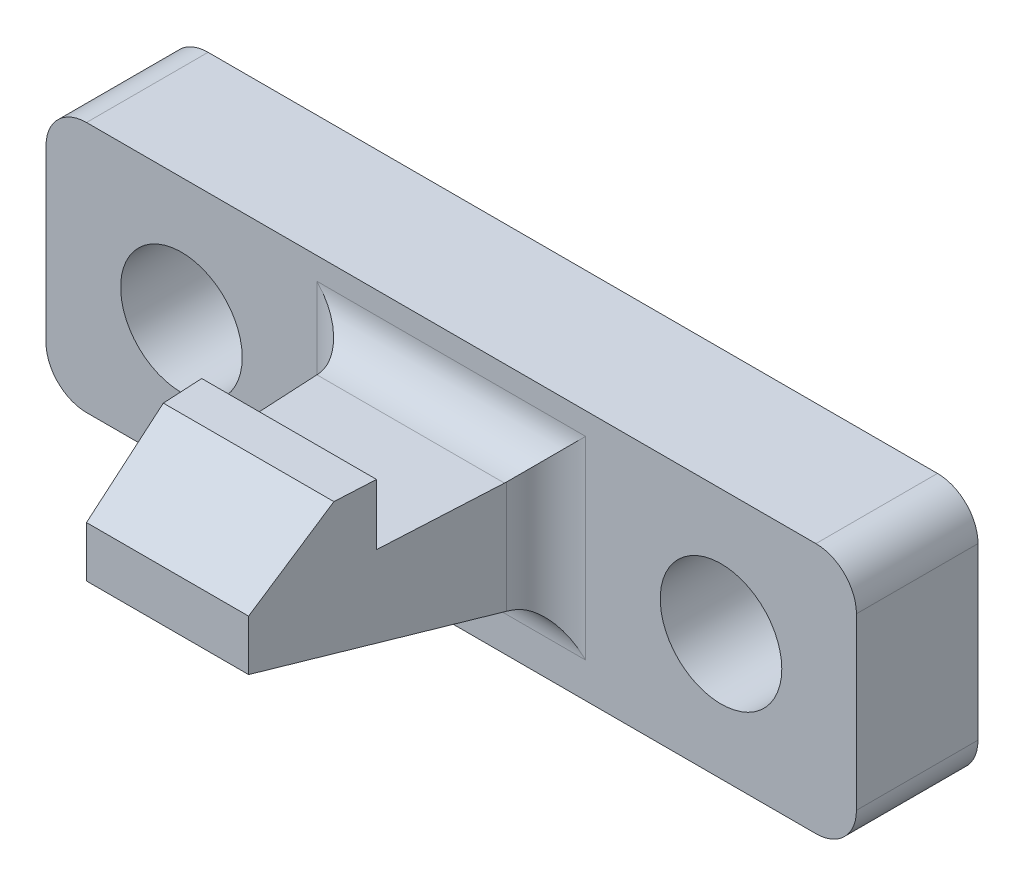
ISO-10303-21;
HEADER;
FILE_DESCRIPTION(('STEP AP214'),'2;1');
FILE_NAME('part.step','',(''),(''),'','','');
FILE_SCHEMA(('AUTOMOTIVE_DESIGN { 1 0 10303 214 1 1 1 1 }'));
ENDSEC;
DATA;
#1=APPLICATION_CONTEXT('core data for automotive mechanical design processes');
#2=APPLICATION_PROTOCOL_DEFINITION('international standard','automotive_design',2000,#1);
#3=PRODUCT_CONTEXT('',#1,'mechanical');
#4=PRODUCT('Part','Part','',(#3));
#5=PRODUCT_RELATED_PRODUCT_CATEGORY('part','',(#4));
#6=PRODUCT_DEFINITION_FORMATION('','',#4);
#7=PRODUCT_DEFINITION_CONTEXT('part definition',#1,'design');
#8=PRODUCT_DEFINITION('design','',#6,#7);
#9=PRODUCT_DEFINITION_SHAPE('','',#8);
#10=(LENGTH_UNIT() NAMED_UNIT(*) SI_UNIT(.MILLI.,.METRE.));
#11=(NAMED_UNIT(*) PLANE_ANGLE_UNIT() SI_UNIT($,.RADIAN.));
#12=(NAMED_UNIT(*) SI_UNIT($,.STERADIAN.) SOLID_ANGLE_UNIT());
#13=UNCERTAINTY_MEASURE_WITH_UNIT(LENGTH_MEASURE(1.E-05),#10,'distance_accuracy_value','');
#14=(GEOMETRIC_REPRESENTATION_CONTEXT(3) GLOBAL_UNCERTAINTY_ASSIGNED_CONTEXT((#13)) GLOBAL_UNIT_ASSIGNED_CONTEXT((#10,
#11,#12)) REPRESENTATION_CONTEXT('',''));
#15=CARTESIAN_POINT('',(0.,0.,0.));
#16=DIRECTION('',(0.,0.,1.));
#17=DIRECTION('',(1.,0.,0.));
#18=AXIS2_PLACEMENT_3D('',#15,#16,#17);
#19=CARTESIAN_POINT('',(10.,3.1,3.));
#20=DIRECTION('',(-1.,0.,0.));
#21=DIRECTION('',(0.,0.,1.));
#22=AXIS2_PLACEMENT_3D('',#19,#20,#21);
#23=PLANE('',#22);
#24=DIRECTION('',(0.,1.,0.));
#25=VECTOR('',#24,1.);
#26=CARTESIAN_POINT('',(10.,3.1,0.));
#27=LINE('',#26,#25);
#28=CARTESIAN_POINT('',(10.,-2.1,0.));
#29=VERTEX_POINT('',#28);
#30=CARTESIAN_POINT('',(10.,2.1,0.));
#31=VERTEX_POINT('',#30);
#32=EDGE_CURVE('E188',#29,#31,#27,.T.);
#33=ORIENTED_EDGE('',*,*,#32,.T.);
#34=DIRECTION('',(0.,0.,-1.));
#35=VECTOR('',#34,1.);
#36=CARTESIAN_POINT('',(10.,2.1,3.));
#37=LINE('',#36,#35);
#38=CARTESIAN_POINT('',(10.,2.1,3.));
#39=VERTEX_POINT('',#38);
#40=EDGE_CURVE('E294',#31,#39,#37,.F.);
#41=ORIENTED_EDGE('',*,*,#40,.T.);
#42=DIRECTION('',(0.,1.,0.));
#43=VECTOR('',#42,1.);
#44=CARTESIAN_POINT('',(10.,3.1,3.));
#45=LINE('',#44,#43);
#46=CARTESIAN_POINT('',(10.,-2.1,3.));
#47=VERTEX_POINT('',#46);
#48=EDGE_CURVE('E220',#47,#39,#45,.T.);
#49=ORIENTED_EDGE('',*,*,#48,.F.);
#50=DIRECTION('',(0.,0.,-1.));
#51=VECTOR('',#50,1.);
#52=CARTESIAN_POINT('',(10.,-2.1,3.));
#53=LINE('',#52,#51);
#54=EDGE_CURVE('E291',#47,#29,#53,.T.);
#55=ORIENTED_EDGE('',*,*,#54,.T.);
#56=EDGE_LOOP('',(#33,#41,#49,#55));
#57=FACE_BOUND('',#56,.T.);
#58=ADVANCED_FACE('F37',(#57),#23,.F.);
#59=CARTESIAN_POINT('',(-10.,3.1,3.));
#60=DIRECTION('',(0.,-1.,0.));
#61=DIRECTION('',(0.,0.,-1.));
#62=AXIS2_PLACEMENT_3D('',#59,#60,#61);
#63=PLANE('',#62);
#64=DIRECTION('',(-1.,0.,0.));
#65=VECTOR('',#64,1.);
#66=CARTESIAN_POINT('',(-10.,3.1,3.));
#67=LINE('',#66,#65);
#68=CARTESIAN_POINT('',(9.,3.1,3.));
#69=VERTEX_POINT('',#68);
#70=CARTESIAN_POINT('',(-9.,3.1,3.));
#71=VERTEX_POINT('',#70);
#72=EDGE_CURVE('E223',#69,#71,#67,.T.);
#73=ORIENTED_EDGE('',*,*,#72,.F.);
#74=DIRECTION('',(0.,0.,-1.));
#75=VECTOR('',#74,1.);
#76=CARTESIAN_POINT('',(9.,3.1,3.));
#77=LINE('',#76,#75);
#78=CARTESIAN_POINT('',(9.,3.1,0.));
#79=VERTEX_POINT('',#78);
#80=EDGE_CURVE('E280',#69,#79,#77,.T.);
#81=ORIENTED_EDGE('',*,*,#80,.T.);
#82=DIRECTION('',(-1.,0.,0.));
#83=VECTOR('',#82,1.);
#84=CARTESIAN_POINT('',(-10.,3.1,0.));
#85=LINE('',#84,#83);
#86=CARTESIAN_POINT('',(-9.,3.1,0.));
#87=VERTEX_POINT('',#86);
#88=EDGE_CURVE('E234',#79,#87,#85,.T.);
#89=ORIENTED_EDGE('',*,*,#88,.T.);
#90=DIRECTION('',(0.,0.,-1.));
#91=VECTOR('',#90,1.);
#92=CARTESIAN_POINT('',(-9.,3.1,3.));
#93=LINE('',#92,#91);
#94=EDGE_CURVE('E267',#87,#71,#93,.F.);
#95=ORIENTED_EDGE('',*,*,#94,.T.);
#96=EDGE_LOOP('',(#73,#81,#89,#95));
#97=FACE_BOUND('',#96,.T.);
#98=ADVANCED_FACE('F338',(#97),#63,.F.);
#99=CARTESIAN_POINT('',(-10.,3.1,3.));
#100=DIRECTION('',(1.,0.,0.));
#101=DIRECTION('',(0.,0.,-1.));
#102=AXIS2_PLACEMENT_3D('',#99,#100,#101);
#103=PLANE('',#102);
#104=DIRECTION('',(0.,-1.,0.));
#105=VECTOR('',#104,1.);
#106=CARTESIAN_POINT('',(-10.,3.1,0.));
#107=LINE('',#106,#105);
#108=CARTESIAN_POINT('',(-10.,2.1,0.));
#109=VERTEX_POINT('',#108);
#110=CARTESIAN_POINT('',(-10.,-2.1,0.));
#111=VERTEX_POINT('',#110);
#112=EDGE_CURVE('E237',#109,#111,#107,.T.);
#113=ORIENTED_EDGE('',*,*,#112,.T.);
#114=DIRECTION('',(0.,0.,-1.));
#115=VECTOR('',#114,1.);
#116=CARTESIAN_POINT('',(-10.,-2.1,3.));
#117=LINE('',#116,#115);
#118=CARTESIAN_POINT('',(-10.,-2.1,3.));
#119=VERTEX_POINT('',#118);
#120=EDGE_CURVE('E11',#111,#119,#117,.F.);
#121=ORIENTED_EDGE('',*,*,#120,.T.);
#122=DIRECTION('',(0.,-1.,0.));
#123=VECTOR('',#122,1.);
#124=CARTESIAN_POINT('',(-10.,3.1,3.));
#125=LINE('',#124,#123);
#126=CARTESIAN_POINT('',(-10.,2.1,3.));
#127=VERTEX_POINT('',#126);
#128=EDGE_CURVE('E227',#127,#119,#125,.T.);
#129=ORIENTED_EDGE('',*,*,#128,.F.);
#130=DIRECTION('',(0.,0.,-1.));
#131=VECTOR('',#130,1.);
#132=CARTESIAN_POINT('',(-10.,2.1,3.));
#133=LINE('',#132,#131);
#134=EDGE_CURVE('E45',#127,#109,#133,.T.);
#135=ORIENTED_EDGE('',*,*,#134,.T.);
#136=EDGE_LOOP('',(#113,#121,#129,#135));
#137=FACE_BOUND('',#136,.T.);
#138=ADVANCED_FACE('F311',(#137),#103,.F.);
#139=CARTESIAN_POINT('',(-10.,-3.1,3.));
#140=DIRECTION('',(0.,1.,0.));
#141=DIRECTION('',(0.,0.,1.));
#142=AXIS2_PLACEMENT_3D('',#139,#140,#141);
#143=PLANE('',#142);
#144=DIRECTION('',(1.,0.,0.));
#145=VECTOR('',#144,1.);
#146=CARTESIAN_POINT('',(-10.,-3.1,0.));
#147=LINE('',#146,#145);
#148=CARTESIAN_POINT('',(-9.,-3.1,0.));
#149=VERTEX_POINT('',#148);
#150=CARTESIAN_POINT('',(9.,-3.1,0.));
#151=VERTEX_POINT('',#150);
#152=EDGE_CURVE('E224',#149,#151,#147,.T.);
#153=ORIENTED_EDGE('',*,*,#152,.T.);
#154=DIRECTION('',(0.,0.,-1.));
#155=VECTOR('',#154,1.);
#156=CARTESIAN_POINT('',(9.,-3.1,3.));
#157=LINE('',#156,#155);
#158=CARTESIAN_POINT('',(9.,-3.1,3.));
#159=VERTEX_POINT('',#158);
#160=EDGE_CURVE('E52',#151,#159,#157,.F.);
#161=ORIENTED_EDGE('',*,*,#160,.T.);
#162=DIRECTION('',(1.,0.,0.));
#163=VECTOR('',#162,1.);
#164=CARTESIAN_POINT('',(-10.,-3.1,3.));
#165=LINE('',#164,#163);
#166=CARTESIAN_POINT('',(-9.,-3.1,3.));
#167=VERTEX_POINT('',#166);
#168=EDGE_CURVE('E229',#167,#159,#165,.T.);
#169=ORIENTED_EDGE('',*,*,#168,.F.);
#170=DIRECTION('',(0.,0.,-1.));
#171=VECTOR('',#170,1.);
#172=CARTESIAN_POINT('',(-9.,-3.1,3.));
#173=LINE('',#172,#171);
#174=EDGE_CURVE('E303',#167,#149,#173,.T.);
#175=ORIENTED_EDGE('',*,*,#174,.T.);
#176=EDGE_LOOP('',(#153,#161,#169,#175));
#177=FACE_BOUND('',#176,.T.);
#178=ADVANCED_FACE('F322',(#177),#143,.F.);
#179=CARTESIAN_POINT('',(0.,0.,3.));
#180=DIRECTION('',(0.,0.,1.));
#181=DIRECTION('',(1.,0.,0.));
#182=AXIS2_PLACEMENT_3D('',#179,#180,#181);
#183=PLANE('',#182);
#184=CARTESIAN_POINT('',(6.65790951084808,0.,3.));
#185=DIRECTION('',(0.,0.,-1.));
#186=DIRECTION('',(-1.,0.,0.));
#187=AXIS2_PLACEMENT_3D('',#184,#185,#186);
#188=CIRCLE('',#187,1.5);
#189=CARTESIAN_POINT('',(8.15790951084808,0.,3.));
#190=VERTEX_POINT('',#189);
#191=EDGE_CURVE('E563',#190,#190,#188,.T.);
#192=ORIENTED_EDGE('',*,*,#191,.T.);
#193=EDGE_LOOP('',(#192));
#194=FACE_BOUND('',#193,.T.);
#195=CARTESIAN_POINT('',(-6.65790951084808,0.,3.));
#196=DIRECTION('',(0.,0.,1.));
#197=DIRECTION('',(1.,0.,0.));
#198=AXIS2_PLACEMENT_3D('',#195,#196,#197);
#199=CIRCLE('',#198,1.5);
#200=CARTESIAN_POINT('',(-5.15790951084808,0.,3.));
#201=VERTEX_POINT('',#200);
#202=EDGE_CURVE('E567',#201,#201,#199,.T.);
#203=ORIENTED_EDGE('',*,*,#202,.F.);
#204=EDGE_LOOP('',(#203));
#205=FACE_BOUND('',#204,.T.);
#206=DIRECTION('',(0.,1.,0.));
#207=VECTOR('',#206,1.);
#208=CARTESIAN_POINT('',(-3.31581902169617,1.55,3.));
#209=LINE('',#208,#207);
#210=CARTESIAN_POINT('',(-3.31581902169617,-2.23077640640439,3.));
#211=VERTEX_POINT('',#210);
#212=CARTESIAN_POINT('',(-3.31581902169617,2.55,3.));
#213=VERTEX_POINT('',#212);
#214=EDGE_CURVE('E242',#211,#213,#209,.T.);
#215=ORIENTED_EDGE('',*,*,#214,.T.);
#216=DIRECTION('',(1.,0.,0.));
#217=VECTOR('',#216,1.);
#218=CARTESIAN_POINT('',(2.36685445498129,2.55,3.));
#219=LINE('',#218,#217);
#220=CARTESIAN_POINT('',(3.31581902169617,2.55,3.));
#221=VERTEX_POINT('',#220);
#222=EDGE_CURVE('E246',#213,#221,#219,.T.);
#223=ORIENTED_EDGE('',*,*,#222,.T.);
#224=DIRECTION('',(0.,-1.,0.));
#225=VECTOR('',#224,1.);
#226=CARTESIAN_POINT('',(3.31581902169617,-1.44999999999997,3.));
#227=LINE('',#226,#225);
#228=CARTESIAN_POINT('',(3.31581902169617,-2.23077640640439,3.));
#229=VERTEX_POINT('',#228);
#230=EDGE_CURVE('E244',#221,#229,#227,.T.);
#231=ORIENTED_EDGE('',*,*,#230,.T.);
#232=DIRECTION('',(-1.,0.,0.));
#233=VECTOR('',#232,1.);
#234=CARTESIAN_POINT('',(-2.36685445498129,-2.23077640640439,3.));
#235=LINE('',#234,#233);
#236=EDGE_CURVE('E231',#229,#211,#235,.T.);
#237=ORIENTED_EDGE('',*,*,#236,.T.);
#238=EDGE_LOOP('',(#215,#223,#231,#237));
#239=FACE_BOUND('',#238,.T.);
#240=ORIENTED_EDGE('',*,*,#48,.T.);
#241=CARTESIAN_POINT('',(9.,2.1,3.));
#242=DIRECTION('',(0.,0.,1.));
#243=DIRECTION('',(1.,0.,0.));
#244=AXIS2_PLACEMENT_3D('',#241,#242,#243);
#245=CIRCLE('',#244,1.);
#246=EDGE_CURVE('E301',#39,#69,#245,.T.);
#247=ORIENTED_EDGE('',*,*,#246,.T.);
#248=ORIENTED_EDGE('',*,*,#72,.T.);
#249=CARTESIAN_POINT('',(-9.,2.1,3.));
#250=DIRECTION('',(0.,0.,1.));
#251=DIRECTION('',(1.,0.,0.));
#252=AXIS2_PLACEMENT_3D('',#249,#250,#251);
#253=CIRCLE('',#252,1.);
#254=EDGE_CURVE('E296',#71,#127,#253,.T.);
#255=ORIENTED_EDGE('',*,*,#254,.T.);
#256=ORIENTED_EDGE('',*,*,#128,.T.);
#257=CARTESIAN_POINT('',(-9.,-2.1,3.));
#258=DIRECTION('',(0.,0.,1.));
#259=DIRECTION('',(1.,0.,0.));
#260=AXIS2_PLACEMENT_3D('',#257,#258,#259);
#261=CIRCLE('',#260,1.);
#262=EDGE_CURVE('E59',#119,#167,#261,.T.);
#263=ORIENTED_EDGE('',*,*,#262,.T.);
#264=ORIENTED_EDGE('',*,*,#168,.T.);
#265=CARTESIAN_POINT('',(9.,-2.1,3.));
#266=DIRECTION('',(0.,0.,1.));
#267=DIRECTION('',(1.,0.,0.));
#268=AXIS2_PLACEMENT_3D('',#265,#266,#267);
#269=CIRCLE('',#268,1.);
#270=EDGE_CURVE('E299',#159,#47,#269,.T.);
#271=ORIENTED_EDGE('',*,*,#270,.T.);
#272=EDGE_LOOP('',(#240,#247,#248,#255,#256,#263,#264,#271));
#273=FACE_BOUND('',#272,.T.);
#274=ADVANCED_FACE('F324',(#194,#205,#239,#273),#183,.T.);
#275=CARTESIAN_POINT('',(0.,0.,0.));
#276=DIRECTION('',(0.,0.,1.));
#277=DIRECTION('',(1.,0.,0.));
#278=AXIS2_PLACEMENT_3D('',#275,#276,#277);
#279=PLANE('',#278);
#280=CARTESIAN_POINT('',(6.65790951084808,0.,0.));
#281=DIRECTION('',(0.,0.,1.));
#282=DIRECTION('',(1.,0.,0.));
#283=AXIS2_PLACEMENT_3D('',#280,#281,#282);
#284=CIRCLE('',#283,1.5);
#285=CARTESIAN_POINT('',(8.15790951084808,0.,0.));
#286=VERTEX_POINT('',#285);
#287=EDGE_CURVE('E599',#286,#286,#284,.T.);
#288=ORIENTED_EDGE('',*,*,#287,.T.);
#289=EDGE_LOOP('',(#288));
#290=FACE_BOUND('',#289,.T.);
#291=CARTESIAN_POINT('',(-6.65790951084808,0.,0.));
#292=DIRECTION('',(0.,0.,1.));
#293=DIRECTION('',(1.,0.,0.));
#294=AXIS2_PLACEMENT_3D('',#291,#292,#293);
#295=CIRCLE('',#294,1.5);
#296=CARTESIAN_POINT('',(-5.15790951084808,0.,0.));
#297=VERTEX_POINT('',#296);
#298=EDGE_CURVE('E271',#297,#297,#295,.F.);
#299=ORIENTED_EDGE('',*,*,#298,.F.);
#300=EDGE_LOOP('',(#299));
#301=FACE_BOUND('',#300,.T.);
#302=ORIENTED_EDGE('',*,*,#88,.F.);
#303=CARTESIAN_POINT('',(9.,2.1,0.));
#304=DIRECTION('',(0.,0.,1.));
#305=DIRECTION('',(1.,0.,0.));
#306=AXIS2_PLACEMENT_3D('',#303,#304,#305);
#307=CIRCLE('',#306,1.);
#308=EDGE_CURVE('E289',#79,#31,#307,.F.);
#309=ORIENTED_EDGE('',*,*,#308,.T.);
#310=ORIENTED_EDGE('',*,*,#32,.F.);
#311=CARTESIAN_POINT('',(9.,-2.1,0.));
#312=DIRECTION('',(0.,0.,1.));
#313=DIRECTION('',(1.,0.,0.));
#314=AXIS2_PLACEMENT_3D('',#311,#312,#313);
#315=CIRCLE('',#314,1.);
#316=EDGE_CURVE('E287',#29,#151,#315,.F.);
#317=ORIENTED_EDGE('',*,*,#316,.T.);
#318=ORIENTED_EDGE('',*,*,#152,.F.);
#319=CARTESIAN_POINT('',(-9.,-2.1,0.));
#320=DIRECTION('',(0.,0.,1.));
#321=DIRECTION('',(1.,0.,0.));
#322=AXIS2_PLACEMENT_3D('',#319,#320,#321);
#323=CIRCLE('',#322,1.);
#324=EDGE_CURVE('E285',#149,#111,#323,.F.);
#325=ORIENTED_EDGE('',*,*,#324,.T.);
#326=ORIENTED_EDGE('',*,*,#112,.F.);
#327=CARTESIAN_POINT('',(-9.,2.1,0.));
#328=DIRECTION('',(0.,0.,1.));
#329=DIRECTION('',(1.,0.,0.));
#330=AXIS2_PLACEMENT_3D('',#327,#328,#329);
#331=CIRCLE('',#330,1.);
#332=EDGE_CURVE('E283',#109,#87,#331,.F.);
#333=ORIENTED_EDGE('',*,*,#332,.T.);
#334=EDGE_LOOP('',(#302,#309,#310,#317,#318,#325,#326,#333));
#335=FACE_BOUND('',#334,.T.);
#336=ADVANCED_FACE('F317',(#290,#301,#335),#279,.F.);
#337=CARTESIAN_POINT('',(0.,1.55,-493.5));
#338=DIRECTION('',(0.,1.,0.));
#339=DIRECTION('',(1.,0.,0.));
#340=AXIS2_PLACEMENT_3D('',#337,#338,#339);
#341=PLANE('',#340);
#342=DIRECTION('',(0.0523359562429438,0.,-0.998629534754574));
#343=VECTOR('',#342,1.);
#344=CARTESIAN_POINT('',(2.,1.55,9.99999999999995));
#345=LINE('',#344,#343);
#346=CARTESIAN_POINT('',(2.15722333784912,1.55,6.99999999999995));
#347=VERTEX_POINT('',#346);
#348=CARTESIAN_POINT('',(2.31444667569824,1.55,4.));
#349=VERTEX_POINT('',#348);
#350=EDGE_CURVE('E202',#347,#349,#345,.T.);
#351=ORIENTED_EDGE('',*,*,#350,.T.);
#352=DIRECTION('',(1.,0.,0.));
#353=VECTOR('',#352,1.);
#354=CARTESIAN_POINT('',(-2.36685445498129,1.55,4.));
#355=LINE('',#354,#353);
#356=CARTESIAN_POINT('',(-2.31444667569824,1.55,4.));
#357=VERTEX_POINT('',#356);
#358=EDGE_CURVE('E249',#349,#357,#355,.F.);
#359=ORIENTED_EDGE('',*,*,#358,.T.);
#360=DIRECTION('',(0.0523359562429438,0.,0.998629534754574));
#361=VECTOR('',#360,1.);
#362=CARTESIAN_POINT('',(-2.,1.55,9.99999999999995));
#363=LINE('',#362,#361);
#364=CARTESIAN_POINT('',(-2.15722333784912,1.55,6.99999999999995));
#365=VERTEX_POINT('',#364);
#366=EDGE_CURVE('E210',#357,#365,#363,.T.);
#367=ORIENTED_EDGE('',*,*,#366,.T.);
#368=DIRECTION('',(1.,0.,0.));
#369=VECTOR('',#368,1.);
#370=CARTESIAN_POINT('',(0.,1.55,6.99999999999995));
#371=LINE('',#370,#369);
#372=EDGE_CURVE('E185',#365,#347,#371,.T.);
#373=ORIENTED_EDGE('',*,*,#372,.T.);
#374=EDGE_LOOP('',(#351,#359,#367,#373));
#375=FACE_BOUND('',#374,.T.);
#376=ADVANCED_FACE('F492',(#375),#341,.T.);
#377=CARTESIAN_POINT('',(-2.,0.300000000000001,9.99999999999995));
#378=DIRECTION('',(-0.998629534754574,0.,0.0523359562429438));
#379=DIRECTION('',(-0.0523359562429438,0.,-0.998629534754574));
#380=AXIS2_PLACEMENT_3D('',#377,#378,#379);
#381=PLANE('',#380);
#382=CARTESIAN_POINT('',(-2.31444667569824,2.55,4.));
#383=DIRECTION('',(-0.998629534754574,0.,0.0523359562429438));
#384=DIRECTION('',(-0.0523359562429438,0.,-0.998629534754574));
#385=AXIS2_PLACEMENT_3D('',#382,#383,#384);
#386=ELLIPSE('',#385,1.00137234599792,1.);
#387=CARTESIAN_POINT('',(-2.31718948694159,1.55137046524543,3.94766404375706));
#388=VERTEX_POINT('',#387);
#389=EDGE_CURVE('E260',#357,#388,#386,.F.);
#390=ORIENTED_EDGE('',*,*,#389,.T.);
#391=DIRECTION('',(0.,1.,0.));
#392=VECTOR('',#391,1.);
#393=CARTESIAN_POINT('',(-2.31718948694159,-1.44999999999997,3.94766404375706));
#394=LINE('',#393,#392);
#395=CARTESIAN_POINT('',(-2.31718948694159,-1.21308398906071,3.94766404375706));
#396=VERTEX_POINT('',#395);
#397=EDGE_CURVE('E254',#388,#396,#394,.F.);
#398=ORIENTED_EDGE('',*,*,#397,.T.);
#399=DIRECTION('',(-0.0507774262496633,-0.242222752730215,-0.968891010920866));
#400=VECTOR('',#399,1.);
#401=CARTESIAN_POINT('',(-2.,0.300000000000001,9.99999999999995));
#402=LINE('',#401,#400);
#403=CARTESIAN_POINT('',(-2.,0.300000000000001,9.99999999999995));
#404=VERTEX_POINT('',#403);
#405=EDGE_CURVE('E217',#404,#396,#402,.T.);
#406=ORIENTED_EDGE('',*,*,#405,.F.);
#407=DIRECTION('',(0.,1.,0.));
#408=VECTOR('',#407,1.);
#409=CARTESIAN_POINT('',(-2.,0.300000000000001,9.99999999999995));
#410=LINE('',#409,#408);
#411=CARTESIAN_POINT('',(-2.,1.55,10.));
#412=VERTEX_POINT('',#411);
#413=EDGE_CURVE('E197',#404,#412,#410,.T.);
#414=ORIENTED_EDGE('',*,*,#413,.T.);
#415=DIRECTION('',(0.0418894228057637,-0.599473351745113,0.799297802326818));
#416=VECTOR('',#415,1.);
#417=CARTESIAN_POINT('',(-1.96861050913495,1.10078962568437,10.5989471657542));
#418=LINE('',#417,#416);
#419=CARTESIAN_POINT('',(-2.10481555856608,3.05,8.));
#420=VERTEX_POINT('',#419);
#421=EDGE_CURVE('E195',#420,#412,#418,.T.);
#422=ORIENTED_EDGE('',*,*,#421,.F.);
#423=DIRECTION('',(-0.0523359562429438,0.,-0.998629534754574));
#424=VECTOR('',#423,1.);
#425=CARTESIAN_POINT('',(-2.,3.05,9.99999999999995));
#426=LINE('',#425,#424);
#427=CARTESIAN_POINT('',(-2.15722333784912,3.05,6.99999999999995));
#428=VERTEX_POINT('',#427);
#429=EDGE_CURVE('E173',#420,#428,#426,.T.);
#430=ORIENTED_EDGE('',*,*,#429,.T.);
#431=DIRECTION('',(0.,1.,0.));
#432=VECTOR('',#431,1.);
#433=CARTESIAN_POINT('',(-2.15722333784912,0.300000000000001,6.99999999999995));
#434=LINE('',#433,#432);
#435=EDGE_CURVE('E178',#365,#428,#434,.T.);
#436=ORIENTED_EDGE('',*,*,#435,.F.);
#437=ORIENTED_EDGE('',*,*,#366,.F.);
#438=EDGE_LOOP('',(#390,#398,#406,#414,#422,#430,#436,#437));
#439=FACE_BOUND('',#438,.T.);
#440=ADVANCED_FACE('F192',(#439),#381,.T.);
#441=CARTESIAN_POINT('',(0.,0.300000000000001,9.99999999999995));
#442=DIRECTION('',(0.,0.,1.));
#443=DIRECTION('',(0.,1.,0.));
#444=AXIS2_PLACEMENT_3D('',#441,#442,#443);
#445=PLANE('',#444);
#446=ORIENTED_EDGE('',*,*,#413,.F.);
#447=DIRECTION('',(-1.,0.,0.));
#448=VECTOR('',#447,1.);
#449=CARTESIAN_POINT('',(0.,0.300000000000001,9.99999999999995));
#450=LINE('',#449,#448);
#451=CARTESIAN_POINT('',(2.,0.300000000000001,9.99999999999995));
#452=VERTEX_POINT('',#451);
#453=EDGE_CURVE('E216',#452,#404,#450,.T.);
#454=ORIENTED_EDGE('',*,*,#453,.F.);
#455=DIRECTION('',(0.,1.,0.));
#456=VECTOR('',#455,1.);
#457=CARTESIAN_POINT('',(2.,0.300000000000001,9.99999999999995));
#458=LINE('',#457,#456);
#459=CARTESIAN_POINT('',(2.,1.55,9.99999999999995));
#460=VERTEX_POINT('',#459);
#461=EDGE_CURVE('E196',#452,#460,#458,.T.);
#462=ORIENTED_EDGE('',*,*,#461,.T.);
#463=DIRECTION('',(1.,0.,0.));
#464=VECTOR('',#463,1.);
#465=CARTESIAN_POINT('',(0.,1.55,9.99999999999995));
#466=LINE('',#465,#464);
#467=EDGE_CURVE('E591',#412,#460,#466,.T.);
#468=ORIENTED_EDGE('',*,*,#467,.F.);
#469=EDGE_LOOP('',(#446,#454,#462,#468));
#470=FACE_BOUND('',#469,.T.);
#471=ADVANCED_FACE('F476',(#470),#445,.T.);
#472=CARTESIAN_POINT('',(0.,0.300000000000001,9.99999999999995));
#473=DIRECTION('',(0.,-0.970142500145332,0.242535625036331));
#474=DIRECTION('',(0.,0.242535625036331,0.970142500145332));
#475=AXIS2_PLACEMENT_3D('',#472,#473,#474);
#476=PLANE('',#475);
#477=CARTESIAN_POINT('',(-3.31581902169617,-1.19999999999998,4.));
#478=DIRECTION('',(0.,-0.970142500145332,0.242535625036331));
#479=DIRECTION('',(0.,-0.242535625036331,-0.970142500145332));
#480=AXIS2_PLACEMENT_3D('',#477,#478,#479);
#481=ELLIPSE('',#480,1.03077640640441,1.);
#482=CARTESIAN_POINT('',(-2.34567652155083,-1.26063390625906,3.75746437496367));
#483=VERTEX_POINT('',#482);
#484=EDGE_CURVE('E264',#396,#483,#481,.F.);
#485=ORIENTED_EDGE('',*,*,#484,.T.);
#486=DIRECTION('',(-1.,0.,0.));
#487=VECTOR('',#486,1.);
#488=CARTESIAN_POINT('',(2.36685445498129,-1.26063390625906,3.75746437496367));
#489=LINE('',#488,#487);
#490=CARTESIAN_POINT('',(2.34567652155083,-1.26063390625906,3.75746437496367));
#491=VERTEX_POINT('',#490);
#492=EDGE_CURVE('E256',#483,#491,#489,.F.);
#493=ORIENTED_EDGE('',*,*,#492,.T.);
#494=CARTESIAN_POINT('',(3.31581902169617,-1.19999999999998,4.));
#495=DIRECTION('',(0.,-0.970142500145332,0.242535625036331));
#496=DIRECTION('',(0.,0.242535625036331,0.970142500145332));
#497=AXIS2_PLACEMENT_3D('',#494,#495,#496);
#498=ELLIPSE('',#497,1.03077640640441,1.);
#499=CARTESIAN_POINT('',(2.31718948694159,-1.21308398906071,3.94766404375706));
#500=VERTEX_POINT('',#499);
#501=EDGE_CURVE('E262',#491,#500,#498,.F.);
#502=ORIENTED_EDGE('',*,*,#501,.T.);
#503=DIRECTION('',(-0.0507774262496633,0.242222752730215,0.968891010920866));
#504=VECTOR('',#503,1.);
#505=CARTESIAN_POINT('',(2.,0.300000000000001,9.99999999999995));
#506=LINE('',#505,#504);
#507=EDGE_CURVE('E200',#500,#452,#506,.T.);
#508=ORIENTED_EDGE('',*,*,#507,.T.);
#509=ORIENTED_EDGE('',*,*,#453,.T.);
#510=ORIENTED_EDGE('',*,*,#405,.T.);
#511=EDGE_LOOP('',(#485,#493,#502,#508,#509,#510));
#512=FACE_BOUND('',#511,.T.);
#513=ADVANCED_FACE('F464',(#512),#476,.T.);
#514=CARTESIAN_POINT('',(2.,0.300000000000001,9.99999999999995));
#515=DIRECTION('',(0.998629534754574,0.,0.0523359562429438));
#516=DIRECTION('',(-0.0523359562429438,0.,0.998629534754574));
#517=AXIS2_PLACEMENT_3D('',#514,#515,#516);
#518=PLANE('',#517);
#519=ORIENTED_EDGE('',*,*,#507,.F.);
#520=DIRECTION('',(0.,-1.,0.));
#521=VECTOR('',#520,1.);
#522=CARTESIAN_POINT('',(2.31718948694159,1.55,3.94766404375706));
#523=LINE('',#522,#521);
#524=CARTESIAN_POINT('',(2.31718948694159,1.55137046524543,3.94766404375706));
#525=VERTEX_POINT('',#524);
#526=EDGE_CURVE('E252',#500,#525,#523,.F.);
#527=ORIENTED_EDGE('',*,*,#526,.T.);
#528=CARTESIAN_POINT('',(2.31444667569824,2.55,4.));
#529=DIRECTION('',(0.998629534754574,0.,0.0523359562429438));
#530=DIRECTION('',(-0.0523359562429438,0.,0.998629534754574));
#531=AXIS2_PLACEMENT_3D('',#528,#529,#530);
#532=ELLIPSE('',#531,1.00137234599792,1.);
#533=EDGE_CURVE('E258',#525,#349,#532,.F.);
#534=ORIENTED_EDGE('',*,*,#533,.T.);
#535=ORIENTED_EDGE('',*,*,#350,.F.);
#536=DIRECTION('',(0.,1.,0.));
#537=VECTOR('',#536,1.);
#538=CARTESIAN_POINT('',(2.15722333784912,1.55,6.99999999999995));
#539=LINE('',#538,#537);
#540=CARTESIAN_POINT('',(2.15722333784912,3.05,6.99999999999995));
#541=VERTEX_POINT('',#540);
#542=EDGE_CURVE('E209',#347,#541,#539,.T.);
#543=ORIENTED_EDGE('',*,*,#542,.T.);
#544=DIRECTION('',(-0.0523359562429438,0.,0.998629534754574));
#545=VECTOR('',#544,1.);
#546=CARTESIAN_POINT('',(2.,3.05,9.99999999999995));
#547=LINE('',#546,#545);
#548=CARTESIAN_POINT('',(2.10481555856608,3.05,8.));
#549=VERTEX_POINT('',#548);
#550=EDGE_CURVE('E175',#541,#549,#547,.T.);
#551=ORIENTED_EDGE('',*,*,#550,.T.);
#552=DIRECTION('',(0.0418894228057637,0.599473351745113,-0.799297802326818));
#553=VECTOR('',#552,1.);
#554=CARTESIAN_POINT('',(1.96861050913495,1.10078962568437,10.5989471657542));
#555=LINE('',#554,#553);
#556=EDGE_CURVE('E179',#460,#549,#555,.T.);
#557=ORIENTED_EDGE('',*,*,#556,.F.);
#558=ORIENTED_EDGE('',*,*,#461,.F.);
#559=EDGE_LOOP('',(#519,#527,#534,#535,#543,#551,#557,#558));
#560=FACE_BOUND('',#559,.T.);
#561=ADVANCED_FACE('F455',(#560),#518,.T.);
#562=CARTESIAN_POINT('',(0.,1.55,10.));
#563=DIRECTION('',(0.,0.8,0.6));
#564=DIRECTION('',(0.,0.6,-0.8));
#565=AXIS2_PLACEMENT_3D('',#562,#563,#564);
#566=PLANE('',#565);
#567=DIRECTION('',(-1.,0.,0.));
#568=VECTOR('',#567,1.);
#569=CARTESIAN_POINT('',(0.,3.05,8.));
#570=LINE('',#569,#568);
#571=EDGE_CURVE('E206',#549,#420,#570,.T.);
#572=ORIENTED_EDGE('',*,*,#571,.T.);
#573=ORIENTED_EDGE('',*,*,#421,.T.);
#574=ORIENTED_EDGE('',*,*,#467,.T.);
#575=ORIENTED_EDGE('',*,*,#556,.T.);
#576=EDGE_LOOP('',(#572,#573,#574,#575));
#577=FACE_BOUND('',#576,.T.);
#578=ADVANCED_FACE('F447',(#577),#566,.T.);
#579=CARTESIAN_POINT('',(0.,1.55,6.99999999999995));
#580=DIRECTION('',(0.,0.,-1.));
#581=DIRECTION('',(0.,-1.,0.));
#582=AXIS2_PLACEMENT_3D('',#579,#580,#581);
#583=PLANE('',#582);
#584=DIRECTION('',(1.,0.,0.));
#585=VECTOR('',#584,1.);
#586=CARTESIAN_POINT('',(0.,3.05,6.99999999999995));
#587=LINE('',#586,#585);
#588=EDGE_CURVE('E169',#428,#541,#587,.T.);
#589=ORIENTED_EDGE('',*,*,#588,.T.);
#590=ORIENTED_EDGE('',*,*,#542,.F.);
#591=ORIENTED_EDGE('',*,*,#372,.F.);
#592=ORIENTED_EDGE('',*,*,#435,.T.);
#593=EDGE_LOOP('',(#589,#590,#591,#592));
#594=FACE_BOUND('',#593,.T.);
#595=ADVANCED_FACE('F183',(#594),#583,.T.);
#596=CARTESIAN_POINT('',(0.,3.05,7.));
#597=DIRECTION('',(0.,-1.,0.));
#598=DIRECTION('',(-1.,0.,0.));
#599=AXIS2_PLACEMENT_3D('',#596,#597,#598);
#600=PLANE('',#599);
#601=ORIENTED_EDGE('',*,*,#571,.F.);
#602=ORIENTED_EDGE('',*,*,#550,.F.);
#603=ORIENTED_EDGE('',*,*,#588,.F.);
#604=ORIENTED_EDGE('',*,*,#429,.F.);
#605=EDGE_LOOP('',(#601,#602,#603,#604));
#606=FACE_BOUND('',#605,.T.);
#607=ADVANCED_FACE('F171',(#606),#600,.F.);
#608=CARTESIAN_POINT('',(0.,-2.23077640640439,4.));
#609=DIRECTION('',(1.,0.,0.));
#610=DIRECTION('',(0.,0.,-1.));
#611=AXIS2_PLACEMENT_3D('',#608,#609,#610);
#612=CYLINDRICAL_SURFACE('',#611,1.);
#613=ORIENTED_EDGE('',*,*,#492,.F.);
#614=CARTESIAN_POINT('',(-3.31581902169617,-2.23077640640439,4.));
#615=DIRECTION('',(0.707106781186548,-0.707106781186547,0.));
#616=DIRECTION('',(0.707106781186548,0.707106781186547,0.));
#617=AXIS2_PLACEMENT_3D('',#614,#615,#616);
#618=ELLIPSE('',#617,1.41421356237309,1.);
#619=EDGE_CURVE('E212',#211,#483,#618,.T.);
#620=ORIENTED_EDGE('',*,*,#619,.F.);
#621=ORIENTED_EDGE('',*,*,#236,.F.);
#622=CARTESIAN_POINT('',(3.31581902169617,-2.23077640640439,4.));
#623=DIRECTION('',(0.707106781186548,0.707106781186547,0.));
#624=DIRECTION('',(0.707106781186548,-0.707106781186547,0.));
#625=AXIS2_PLACEMENT_3D('',#622,#623,#624);
#626=ELLIPSE('',#625,1.41421356237309,1.);
#627=EDGE_CURVE('E274',#491,#229,#626,.F.);
#628=ORIENTED_EDGE('',*,*,#627,.F.);
#629=EDGE_LOOP('',(#613,#620,#621,#628));
#630=FACE_BOUND('',#629,.T.);
#631=ADVANCED_FACE('F364',(#630),#612,.F.);
#632=CARTESIAN_POINT('',(-3.31581902169617,0.,4.));
#633=DIRECTION('',(0.,-1.,0.));
#634=DIRECTION('',(0.,0.,-1.));
#635=AXIS2_PLACEMENT_3D('',#632,#633,#634);
#636=CYLINDRICAL_SURFACE('',#635,1.);
#637=ORIENTED_EDGE('',*,*,#397,.F.);
#638=CARTESIAN_POINT('',(-3.31581902169617,2.55,4.));
#639=DIRECTION('',(-0.707106781186548,-0.707106781186547,0.));
#640=DIRECTION('',(0.707106781186548,-0.707106781186547,0.));
#641=AXIS2_PLACEMENT_3D('',#638,#639,#640);
#642=ELLIPSE('',#641,1.41421356237309,1.);
#643=EDGE_CURVE('E270',#213,#388,#642,.T.);
#644=ORIENTED_EDGE('',*,*,#643,.F.);
#645=ORIENTED_EDGE('',*,*,#214,.F.);
#646=ORIENTED_EDGE('',*,*,#619,.T.);
#647=ORIENTED_EDGE('',*,*,#484,.F.);
#648=EDGE_LOOP('',(#637,#644,#645,#646,#647));
#649=FACE_BOUND('',#648,.T.);
#650=ADVANCED_FACE('F360',(#649),#636,.F.);
#651=CARTESIAN_POINT('',(3.31581902169617,0.,4.));
#652=DIRECTION('',(0.,1.,0.));
#653=DIRECTION('',(0.,0.,1.));
#654=AXIS2_PLACEMENT_3D('',#651,#652,#653);
#655=CYLINDRICAL_SURFACE('',#654,1.);
#656=ORIENTED_EDGE('',*,*,#627,.T.);
#657=ORIENTED_EDGE('',*,*,#230,.F.);
#658=CARTESIAN_POINT('',(3.31581902169617,2.55,4.));
#659=DIRECTION('',(-0.707106781186548,0.707106781186547,0.));
#660=DIRECTION('',(0.707106781186548,0.707106781186547,0.));
#661=AXIS2_PLACEMENT_3D('',#658,#659,#660);
#662=ELLIPSE('',#661,1.41421356237309,1.);
#663=EDGE_CURVE('E268',#525,#221,#662,.F.);
#664=ORIENTED_EDGE('',*,*,#663,.F.);
#665=ORIENTED_EDGE('',*,*,#526,.F.);
#666=ORIENTED_EDGE('',*,*,#501,.F.);
#667=EDGE_LOOP('',(#656,#657,#664,#665,#666));
#668=FACE_BOUND('',#667,.T.);
#669=ADVANCED_FACE('F356',(#668),#655,.F.);
#670=CARTESIAN_POINT('',(0.,2.55,4.));
#671=DIRECTION('',(-1.,0.,0.));
#672=DIRECTION('',(0.,0.,1.));
#673=AXIS2_PLACEMENT_3D('',#670,#671,#672);
#674=CYLINDRICAL_SURFACE('',#673,1.);
#675=ORIENTED_EDGE('',*,*,#389,.F.);
#676=ORIENTED_EDGE('',*,*,#358,.F.);
#677=ORIENTED_EDGE('',*,*,#533,.F.);
#678=ORIENTED_EDGE('',*,*,#663,.T.);
#679=ORIENTED_EDGE('',*,*,#222,.F.);
#680=ORIENTED_EDGE('',*,*,#643,.T.);
#681=EDGE_LOOP('',(#675,#676,#677,#678,#679,#680));
#682=FACE_BOUND('',#681,.T.);
#683=ADVANCED_FACE('F352',(#682),#674,.F.);
#684=CARTESIAN_POINT('',(-6.65790951084808,0.,-0.00100000000000013));
#685=DIRECTION('',(0.,0.,1.));
#686=DIRECTION('',(1.,0.,0.));
#687=AXIS2_PLACEMENT_3D('',#684,#685,#686);
#688=CYLINDRICAL_SURFACE('',#687,1.5);
#689=CARTESIAN_POINT('',(-5.15790951084808,0.,3.));
#690=CARTESIAN_POINT('',(-5.15790951084808,0.,2.96875));
#691=CARTESIAN_POINT('',(-5.15790951084808,0.,2.9375));
#692=CARTESIAN_POINT('',(-5.15790951084808,0.,2.875));
#693=CARTESIAN_POINT('',(-5.15790951084808,0.,2.84375));
#694=CARTESIAN_POINT('',(-5.15790951084808,0.,2.78125));
#695=CARTESIAN_POINT('',(-5.15790951084808,0.,2.75));
#696=CARTESIAN_POINT('',(-5.15790951084808,0.,2.6875));
#697=CARTESIAN_POINT('',(-5.15790951084808,0.,2.65625));
#698=CARTESIAN_POINT('',(-5.15790951084808,0.,2.59375));
#699=CARTESIAN_POINT('',(-5.15790951084808,0.,2.5625));
#700=CARTESIAN_POINT('',(-5.15790951084808,0.,2.5));
#701=CARTESIAN_POINT('',(-5.15790951084808,0.,2.46875));
#702=CARTESIAN_POINT('',(-5.15790951084808,0.,2.40625));
#703=CARTESIAN_POINT('',(-5.15790951084808,0.,2.375));
#704=CARTESIAN_POINT('',(-5.15790951084808,0.,2.3125));
#705=CARTESIAN_POINT('',(-5.15790951084808,0.,2.28125));
#706=CARTESIAN_POINT('',(-5.15790951084808,0.,2.21875));
#707=CARTESIAN_POINT('',(-5.15790951084808,0.,2.1875));
#708=CARTESIAN_POINT('',(-5.15790951084808,0.,2.125));
#709=CARTESIAN_POINT('',(-5.15790951084808,0.,2.09375));
#710=CARTESIAN_POINT('',(-5.15790951084808,0.,2.03125));
#711=CARTESIAN_POINT('',(-5.15790951084808,0.,2.));
#712=CARTESIAN_POINT('',(-5.15790951084808,0.,1.9375));
#713=CARTESIAN_POINT('',(-5.15790951084808,0.,1.90625));
#714=CARTESIAN_POINT('',(-5.15790951084808,0.,1.84375));
#715=CARTESIAN_POINT('',(-5.15790951084808,0.,1.8125));
#716=CARTESIAN_POINT('',(-5.15790951084808,0.,1.75));
#717=CARTESIAN_POINT('',(-5.15790951084808,0.,1.71875));
#718=CARTESIAN_POINT('',(-5.15790951084808,0.,1.65625));
#719=CARTESIAN_POINT('',(-5.15790951084808,0.,1.625));
#720=CARTESIAN_POINT('',(-5.15790951084808,0.,1.5625));
#721=CARTESIAN_POINT('',(-5.15790951084808,0.,1.53125));
#722=CARTESIAN_POINT('',(-5.15790951084808,0.,1.46875));
#723=CARTESIAN_POINT('',(-5.15790951084808,0.,1.4375));
#724=CARTESIAN_POINT('',(-5.15790951084808,0.,1.375));
#725=CARTESIAN_POINT('',(-5.15790951084808,0.,1.34375));
#726=CARTESIAN_POINT('',(-5.15790951084808,0.,1.28125));
#727=CARTESIAN_POINT('',(-5.15790951084808,0.,1.25));
#728=CARTESIAN_POINT('',(-5.15790951084808,0.,1.1875));
#729=CARTESIAN_POINT('',(-5.15790951084808,0.,1.15625));
#730=CARTESIAN_POINT('',(-5.15790951084808,0.,1.09375));
#731=CARTESIAN_POINT('',(-5.15790951084808,0.,1.0625));
#732=CARTESIAN_POINT('',(-5.15790951084808,0.,1.));
#733=CARTESIAN_POINT('',(-5.15790951084808,0.,0.96875));
#734=CARTESIAN_POINT('',(-5.15790951084808,0.,0.90625));
#735=CARTESIAN_POINT('',(-5.15790951084808,0.,0.875));
#736=CARTESIAN_POINT('',(-5.15790951084808,0.,0.8125));
#737=CARTESIAN_POINT('',(-5.15790951084808,0.,0.78125));
#738=CARTESIAN_POINT('',(-5.15790951084808,0.,0.71875));
#739=CARTESIAN_POINT('',(-5.15790951084808,0.,0.6875));
#740=CARTESIAN_POINT('',(-5.15790951084808,0.,0.625));
#741=CARTESIAN_POINT('',(-5.15790951084808,0.,0.59375));
#742=CARTESIAN_POINT('',(-5.15790951084808,0.,0.53125));
#743=CARTESIAN_POINT('',(-5.15790951084808,0.,0.5));
#744=CARTESIAN_POINT('',(-5.15790951084808,0.,0.4375));
#745=CARTESIAN_POINT('',(-5.15790951084808,0.,0.40625));
#746=CARTESIAN_POINT('',(-5.15790951084808,0.,0.34375));
#747=CARTESIAN_POINT('',(-5.15790951084808,0.,0.3125));
#748=CARTESIAN_POINT('',(-5.15790951084808,0.,0.25));
#749=CARTESIAN_POINT('',(-5.15790951084808,0.,0.21875));
#750=CARTESIAN_POINT('',(-5.15790951084808,0.,0.15625));
#751=CARTESIAN_POINT('',(-5.15790951084808,0.,0.125));
#752=CARTESIAN_POINT('',(-5.15790951084808,0.,0.0625000000000001));
#753=CARTESIAN_POINT('',(-5.15790951084808,0.,0.0312500000000001));
#754=CARTESIAN_POINT('',(-5.15790951084808,0.,0.));
#755=B_SPLINE_CURVE_WITH_KNOTS('',3,(#689,#690,#691,#692,#693,#694,#695,#696,#697,#698,#699,
#700,#701,#702,#703,#704,#705,#706,#707,#708,#709,#710,#711,#712,#713,#714,#715,#716,#717,#718,
#719,#720,#721,#722,#723,#724,#725,#726,#727,#728,#729,#730,#731,#732,#733,#734,#735,#736,#737,
#738,#739,#740,#741,#742,#743,#744,#745,#746,#747,#748,#749,#750,#751,#752,#753,#754),
.UNSPECIFIED.,.F.,.F.,(4,2,2,2,2,2,2,2,2,2,2,2,2,2,2,2,2,2,2,2,2,2,2,2,2,2,2,2,2,2,2,2,4),(0.,
0.0937500000000001,0.1875,0.28125,0.375,0.46875,0.5625,0.65625,0.75,0.84375,0.9375,1.03125,
1.125,1.21875,1.3125,1.40625,1.5,1.59375,1.6875,1.78125,1.875,1.96875,2.0625,2.15625,2.25,
2.34375,2.4375,2.53125,2.625,2.71875,2.8125,2.90625,3.),.UNSPECIFIED.);
#756=EDGE_CURVE('BSEAM355',#201,#297,#755,.T.);
#757=ORIENTED_EDGE('',*,*,#202,.T.);
#758=ORIENTED_EDGE('',*,*,#298,.T.);
#759=ORIENTED_EDGE('',*,*,#756,.T.);
#760=ORIENTED_EDGE('',*,*,#756,.F.);
#761=EDGE_LOOP('',(#757,#759,#758,#760));
#762=FACE_BOUND('',#761,.T.);
#763=ADVANCED_FACE('F355',(#762),#688,.F.);
#764=CARTESIAN_POINT('',(6.65790951084808,0.,-0.00100000000000013));
#765=DIRECTION('',(0.,0.,1.));
#766=DIRECTION('',(1.,0.,0.));
#767=AXIS2_PLACEMENT_3D('',#764,#765,#766);
#768=CYLINDRICAL_SURFACE('',#767,1.5);
#769=CARTESIAN_POINT('',(8.15790951084808,0.,3.));
#770=CARTESIAN_POINT('',(8.15790951084808,0.,2.96875));
#771=CARTESIAN_POINT('',(8.15790951084808,0.,2.9375));
#772=CARTESIAN_POINT('',(8.15790951084808,0.,2.875));
#773=CARTESIAN_POINT('',(8.15790951084808,0.,2.84375));
#774=CARTESIAN_POINT('',(8.15790951084808,0.,2.78125));
#775=CARTESIAN_POINT('',(8.15790951084808,0.,2.75));
#776=CARTESIAN_POINT('',(8.15790951084808,0.,2.6875));
#777=CARTESIAN_POINT('',(8.15790951084808,0.,2.65625));
#778=CARTESIAN_POINT('',(8.15790951084808,0.,2.59375));
#779=CARTESIAN_POINT('',(8.15790951084808,0.,2.5625));
#780=CARTESIAN_POINT('',(8.15790951084808,0.,2.5));
#781=CARTESIAN_POINT('',(8.15790951084808,0.,2.46875));
#782=CARTESIAN_POINT('',(8.15790951084808,0.,2.40625));
#783=CARTESIAN_POINT('',(8.15790951084808,0.,2.375));
#784=CARTESIAN_POINT('',(8.15790951084808,0.,2.3125));
#785=CARTESIAN_POINT('',(8.15790951084808,0.,2.28125));
#786=CARTESIAN_POINT('',(8.15790951084808,0.,2.21875));
#787=CARTESIAN_POINT('',(8.15790951084808,0.,2.1875));
#788=CARTESIAN_POINT('',(8.15790951084808,0.,2.125));
#789=CARTESIAN_POINT('',(8.15790951084808,0.,2.09375));
#790=CARTESIAN_POINT('',(8.15790951084808,0.,2.03125));
#791=CARTESIAN_POINT('',(8.15790951084808,0.,2.));
#792=CARTESIAN_POINT('',(8.15790951084808,0.,1.9375));
#793=CARTESIAN_POINT('',(8.15790951084808,0.,1.90625));
#794=CARTESIAN_POINT('',(8.15790951084808,0.,1.84375));
#795=CARTESIAN_POINT('',(8.15790951084808,0.,1.8125));
#796=CARTESIAN_POINT('',(8.15790951084808,0.,1.75));
#797=CARTESIAN_POINT('',(8.15790951084808,0.,1.71875));
#798=CARTESIAN_POINT('',(8.15790951084808,0.,1.65625));
#799=CARTESIAN_POINT('',(8.15790951084808,0.,1.625));
#800=CARTESIAN_POINT('',(8.15790951084808,0.,1.5625));
#801=CARTESIAN_POINT('',(8.15790951084808,0.,1.53125));
#802=CARTESIAN_POINT('',(8.15790951084808,0.,1.46875));
#803=CARTESIAN_POINT('',(8.15790951084808,0.,1.4375));
#804=CARTESIAN_POINT('',(8.15790951084808,0.,1.375));
#805=CARTESIAN_POINT('',(8.15790951084808,0.,1.34375));
#806=CARTESIAN_POINT('',(8.15790951084808,0.,1.28125));
#807=CARTESIAN_POINT('',(8.15790951084808,0.,1.25));
#808=CARTESIAN_POINT('',(8.15790951084808,0.,1.1875));
#809=CARTESIAN_POINT('',(8.15790951084808,0.,1.15625));
#810=CARTESIAN_POINT('',(8.15790951084808,0.,1.09375));
#811=CARTESIAN_POINT('',(8.15790951084808,0.,1.0625));
#812=CARTESIAN_POINT('',(8.15790951084808,0.,1.));
#813=CARTESIAN_POINT('',(8.15790951084808,0.,0.96875));
#814=CARTESIAN_POINT('',(8.15790951084808,0.,0.90625));
#815=CARTESIAN_POINT('',(8.15790951084808,0.,0.875));
#816=CARTESIAN_POINT('',(8.15790951084808,0.,0.8125));
#817=CARTESIAN_POINT('',(8.15790951084808,0.,0.78125));
#818=CARTESIAN_POINT('',(8.15790951084808,0.,0.71875));
#819=CARTESIAN_POINT('',(8.15790951084808,0.,0.6875));
#820=CARTESIAN_POINT('',(8.15790951084808,0.,0.625));
#821=CARTESIAN_POINT('',(8.15790951084808,0.,0.59375));
#822=CARTESIAN_POINT('',(8.15790951084808,0.,0.53125));
#823=CARTESIAN_POINT('',(8.15790951084808,0.,0.5));
#824=CARTESIAN_POINT('',(8.15790951084808,0.,0.4375));
#825=CARTESIAN_POINT('',(8.15790951084808,0.,0.40625));
#826=CARTESIAN_POINT('',(8.15790951084808,0.,0.34375));
#827=CARTESIAN_POINT('',(8.15790951084808,0.,0.3125));
#828=CARTESIAN_POINT('',(8.15790951084808,0.,0.25));
#829=CARTESIAN_POINT('',(8.15790951084808,0.,0.21875));
#830=CARTESIAN_POINT('',(8.15790951084808,0.,0.15625));
#831=CARTESIAN_POINT('',(8.15790951084808,0.,0.125));
#832=CARTESIAN_POINT('',(8.15790951084808,0.,0.0625000000000001));
#833=CARTESIAN_POINT('',(8.15790951084808,0.,0.03125));
#834=CARTESIAN_POINT('',(8.15790951084808,0.,0.));
#835=B_SPLINE_CURVE_WITH_KNOTS('',3,(#769,#770,#771,#772,#773,#774,#775,#776,#777,#778,#779,
#780,#781,#782,#783,#784,#785,#786,#787,#788,#789,#790,#791,#792,#793,#794,#795,#796,#797,#798,
#799,#800,#801,#802,#803,#804,#805,#806,#807,#808,#809,#810,#811,#812,#813,#814,#815,#816,#817,
#818,#819,#820,#821,#822,#823,#824,#825,#826,#827,#828,#829,#830,#831,#832,#833,#834),
.UNSPECIFIED.,.F.,.F.,(4,2,2,2,2,2,2,2,2,2,2,2,2,2,2,2,2,2,2,2,2,2,2,2,2,2,2,2,2,2,2,2,4),(0.,
0.0937500000000001,0.1875,0.28125,0.375,0.46875,0.5625,0.65625,0.75,0.84375,0.9375,1.03125,
1.125,1.21875,1.3125,1.40625,1.5,1.59375,1.6875,1.78125,1.875,1.96875,2.0625,2.15625,2.25,
2.34375,2.4375,2.53125,2.625,2.71875,2.8125,2.90625,3.),.UNSPECIFIED.);
#836=EDGE_CURVE('BSEAM371',#190,#286,#835,.T.);
#837=ORIENTED_EDGE('',*,*,#191,.F.);
#838=ORIENTED_EDGE('',*,*,#287,.F.);
#839=ORIENTED_EDGE('',*,*,#836,.T.);
#840=ORIENTED_EDGE('',*,*,#836,.F.);
#841=EDGE_LOOP('',(#837,#839,#838,#840));
#842=FACE_BOUND('',#841,.T.);
#843=ADVANCED_FACE('F371',(#842),#768,.F.);
#844=CARTESIAN_POINT('',(9.,2.1,3.));
#845=DIRECTION('',(0.,0.,-1.));
#846=DIRECTION('',(-1.,0.,0.));
#847=AXIS2_PLACEMENT_3D('',#844,#845,#846);
#848=CYLINDRICAL_SURFACE('',#847,1.);
#849=ORIENTED_EDGE('',*,*,#246,.F.);
#850=ORIENTED_EDGE('',*,*,#40,.F.);
#851=ORIENTED_EDGE('',*,*,#308,.F.);
#852=ORIENTED_EDGE('',*,*,#80,.F.);
#853=EDGE_LOOP('',(#849,#850,#851,#852));
#854=FACE_BOUND('',#853,.T.);
#855=ADVANCED_FACE('F335',(#854),#848,.T.);
#856=CARTESIAN_POINT('',(9.,-2.1,3.));
#857=DIRECTION('',(0.,0.,-1.));
#858=DIRECTION('',(-1.,0.,0.));
#859=AXIS2_PLACEMENT_3D('',#856,#857,#858);
#860=CYLINDRICAL_SURFACE('',#859,1.);
#861=ORIENTED_EDGE('',*,*,#270,.F.);
#862=ORIENTED_EDGE('',*,*,#160,.F.);
#863=ORIENTED_EDGE('',*,*,#316,.F.);
#864=ORIENTED_EDGE('',*,*,#54,.F.);
#865=EDGE_LOOP('',(#861,#862,#863,#864));
#866=FACE_BOUND('',#865,.T.);
#867=ADVANCED_FACE('F328',(#866),#860,.T.);
#868=CARTESIAN_POINT('',(-9.,-2.1,3.));
#869=DIRECTION('',(0.,0.,-1.));
#870=DIRECTION('',(-1.,0.,0.));
#871=AXIS2_PLACEMENT_3D('',#868,#869,#870);
#872=CYLINDRICAL_SURFACE('',#871,1.);
#873=ORIENTED_EDGE('',*,*,#262,.F.);
#874=ORIENTED_EDGE('',*,*,#120,.F.);
#875=ORIENTED_EDGE('',*,*,#324,.F.);
#876=ORIENTED_EDGE('',*,*,#174,.F.);
#877=EDGE_LOOP('',(#873,#874,#875,#876));
#878=FACE_BOUND('',#877,.T.);
#879=ADVANCED_FACE('F321',(#878),#872,.T.);
#880=CARTESIAN_POINT('',(-9.,2.1,3.));
#881=DIRECTION('',(0.,0.,-1.));
#882=DIRECTION('',(-1.,0.,0.));
#883=AXIS2_PLACEMENT_3D('',#880,#881,#882);
#884=CYLINDRICAL_SURFACE('',#883,1.);
#885=ORIENTED_EDGE('',*,*,#254,.F.);
#886=ORIENTED_EDGE('',*,*,#94,.F.);
#887=ORIENTED_EDGE('',*,*,#332,.F.);
#888=ORIENTED_EDGE('',*,*,#134,.F.);
#889=EDGE_LOOP('',(#885,#886,#887,#888));
#890=FACE_BOUND('',#889,.T.);
#891=ADVANCED_FACE('F39',(#890),#884,.T.);
#892=CLOSED_SHELL('',(#58,#98,#138,#178,#274,#336,#376,#440,#471,#513,#561,#578,#595,#607,#631,
#650,#669,#683,#763,#843,#855,#867,#879,#891));
#893=MANIFOLD_SOLID_BREP('B2',#892);
#894=ADVANCED_BREP_SHAPE_REPRESENTATION('',(#18,#893),#14);
#895=SHAPE_DEFINITION_REPRESENTATION(#9,#894);
ENDSEC;
END-ISO-10303-21;
